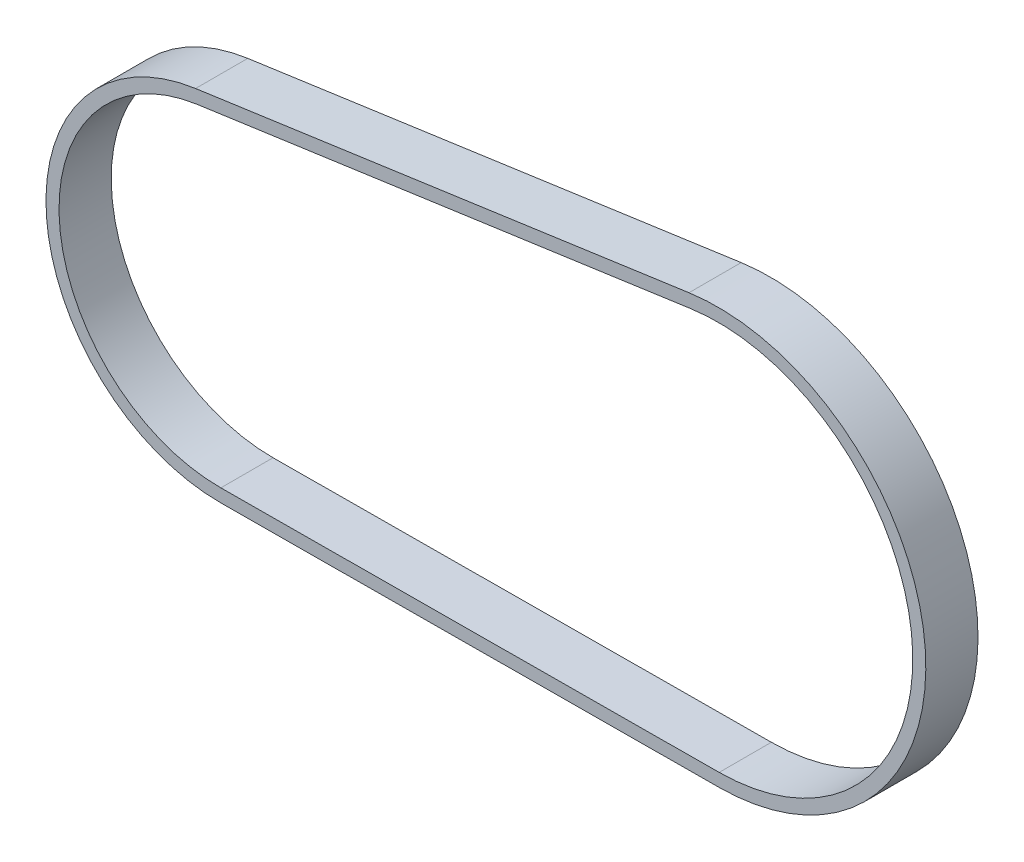
ISO-10303-21;
HEADER;
FILE_DESCRIPTION(('STEP AP214'),'2;1');
FILE_NAME('part.step','',(''),(''),'','','');
FILE_SCHEMA(('AUTOMOTIVE_DESIGN { 1 0 10303 214 1 1 1 1 }'));
ENDSEC;
DATA;
#1=APPLICATION_CONTEXT('core data for automotive mechanical design processes');
#2=APPLICATION_PROTOCOL_DEFINITION('international standard','automotive_design',2000,#1);
#3=PRODUCT_CONTEXT('',#1,'mechanical');
#4=PRODUCT('Part','Part','',(#3));
#5=PRODUCT_RELATED_PRODUCT_CATEGORY('part','',(#4));
#6=PRODUCT_DEFINITION_FORMATION('','',#4);
#7=PRODUCT_DEFINITION_CONTEXT('part definition',#1,'design');
#8=PRODUCT_DEFINITION('design','',#6,#7);
#9=PRODUCT_DEFINITION_SHAPE('','',#8);
#10=(LENGTH_UNIT() NAMED_UNIT(*) SI_UNIT(.MILLI.,.METRE.));
#11=(NAMED_UNIT(*) PLANE_ANGLE_UNIT() SI_UNIT($,.RADIAN.));
#12=(NAMED_UNIT(*) SI_UNIT($,.STERADIAN.) SOLID_ANGLE_UNIT());
#13=UNCERTAINTY_MEASURE_WITH_UNIT(LENGTH_MEASURE(1.E-05),#10,'distance_accuracy_value','');
#14=(GEOMETRIC_REPRESENTATION_CONTEXT(3) GLOBAL_UNCERTAINTY_ASSIGNED_CONTEXT((#13)) GLOBAL_UNIT_ASSIGNED_CONTEXT((#10,
#11,#12)) REPRESENTATION_CONTEXT('',''));
#15=CARTESIAN_POINT('',(0.,0.,0.));
#16=DIRECTION('',(0.,0.,1.));
#17=DIRECTION('',(1.,0.,0.));
#18=AXIS2_PLACEMENT_3D('',#15,#16,#17);
#19=CARTESIAN_POINT('',(57.260066999998,4.19191014874665,-6.));
#20=DIRECTION('',(0.,0.,1.));
#21=DIRECTION('',(1.,0.,0.));
#22=AXIS2_PLACEMENT_3D('',#19,#20,#21);
#23=CYLINDRICAL_SURFACE('',#22,23.876);
#24=CARTESIAN_POINT('',(57.260066999998,4.19191014874665,0.));
#25=DIRECTION('',(0.,0.,1.));
#26=DIRECTION('',(-1.,0.,0.));
#27=AXIS2_PLACEMENT_3D('',#24,#25,#26);
#28=CIRCLE('',#27,23.876);
#29=CARTESIAN_POINT('',(57.3917669520698,-19.6837266201989,0.));
#30=VERTEX_POINT('',#29);
#31=CARTESIAN_POINT('',(53.9132105438982,27.8321708888963,0.));
#32=VERTEX_POINT('',#31);
#33=EDGE_CURVE('E163',#30,#32,#28,.T.);
#34=ORIENTED_EDGE('',*,*,#33,.F.);
#35=DIRECTION('',(0.,0.,1.));
#36=VECTOR('',#35,1.);
#37=CARTESIAN_POINT('',(57.3917669520698,-19.6837266201989,-6.));
#38=LINE('',#37,#36);
#39=CARTESIAN_POINT('',(57.3917669520698,-19.6837266201989,-6.));
#40=VERTEX_POINT('',#39);
#41=EDGE_CURVE('E12',#40,#30,#38,.T.);
#42=ORIENTED_EDGE('',*,*,#41,.F.);
#43=CARTESIAN_POINT('',(57.260066999998,4.19191014874665,-6.));
#44=DIRECTION('',(0.,0.,1.));
#45=DIRECTION('',(-1.,0.,0.));
#46=AXIS2_PLACEMENT_3D('',#43,#44,#45);
#47=CIRCLE('',#46,23.876);
#48=CARTESIAN_POINT('',(53.9132105438982,27.8321708888963,-6.));
#49=VERTEX_POINT('',#48);
#50=EDGE_CURVE('E167',#40,#49,#47,.T.);
#51=ORIENTED_EDGE('',*,*,#50,.T.);
#52=DIRECTION('',(0.,0.,1.));
#53=VECTOR('',#52,1.);
#54=CARTESIAN_POINT('',(53.9132105438982,27.8321708888963,-6.));
#55=LINE('',#54,#53);
#56=EDGE_CURVE('E68',#49,#32,#55,.T.);
#57=ORIENTED_EDGE('',*,*,#56,.T.);
#58=EDGE_LOOP('',(#34,#42,#51,#57));
#59=FACE_BOUND('',#58,.T.);
#60=ADVANCED_FACE('F65',(#59),#23,.T.);
#61=CARTESIAN_POINT('',(57.3917669520698,-19.6837266201989,-6.));
#62=DIRECTION('',(0.00551599732249396,-0.999984786771048,0.));
#63=DIRECTION('',(0.999984786771048,0.00551599732249396,0.));
#64=AXIS2_PLACEMENT_3D('',#61,#62,#63);
#65=PLANE('',#64);
#66=DIRECTION('',(0.999984786771048,0.00551599732249396,0.));
#67=VECTOR('',#66,1.);
#68=CARTESIAN_POINT('',(57.3917669520698,-19.6837266201989,0.));
#69=LINE('',#68,#67);
#70=CARTESIAN_POINT('',(0.110319946449886,-19.999695735421,0.));
#71=VERTEX_POINT('',#70);
#72=EDGE_CURVE('E171',#71,#30,#69,.T.);
#73=ORIENTED_EDGE('',*,*,#72,.F.);
#74=DIRECTION('',(0.,0.,1.));
#75=VECTOR('',#74,1.);
#76=CARTESIAN_POINT('',(0.110319946449886,-19.999695735421,-6.));
#77=LINE('',#76,#75);
#78=CARTESIAN_POINT('',(0.110319946449886,-19.999695735421,-6.));
#79=VERTEX_POINT('',#78);
#80=EDGE_CURVE('E73',#79,#71,#77,.T.);
#81=ORIENTED_EDGE('',*,*,#80,.F.);
#82=DIRECTION('',(0.999984786771048,0.00551599732249396,0.));
#83=VECTOR('',#82,1.);
#84=CARTESIAN_POINT('',(57.3917669520698,-19.6837266201989,-6.));
#85=LINE('',#84,#83);
#86=EDGE_CURVE('E177',#79,#40,#85,.T.);
#87=ORIENTED_EDGE('',*,*,#86,.T.);
#88=ORIENTED_EDGE('',*,*,#41,.T.);
#89=EDGE_LOOP('',(#73,#81,#87,#88));
#90=FACE_BOUND('',#89,.T.);
#91=ADVANCED_FACE('F203',(#90),#65,.T.);
#92=CARTESIAN_POINT('',(0.,0.,-6.));
#93=DIRECTION('',(0.,0.,1.));
#94=DIRECTION('',(1.,0.,0.));
#95=AXIS2_PLACEMENT_3D('',#92,#93,#94);
#96=CYLINDRICAL_SURFACE('',#95,20.);
#97=CARTESIAN_POINT('',(0.,0.,0.));
#98=DIRECTION('',(0.,0.,1.));
#99=DIRECTION('',(-1.,0.,0.));
#100=AXIS2_PLACEMENT_3D('',#97,#98,#99);
#101=CIRCLE('',#100,20.);
#102=CARTESIAN_POINT('',(-2.80353196188625,19.8025303569691,0.));
#103=VERTEX_POINT('',#102);
#104=EDGE_CURVE('E185',#103,#71,#101,.T.);
#105=ORIENTED_EDGE('',*,*,#104,.F.);
#106=DIRECTION('',(0.,0.,1.));
#107=VECTOR('',#106,1.);
#108=CARTESIAN_POINT('',(-2.80353196188625,19.8025303569691,-6.));
#109=LINE('',#108,#107);
#110=CARTESIAN_POINT('',(-2.80353196188625,19.8025303569691,-6.));
#111=VERTEX_POINT('',#110);
#112=EDGE_CURVE('E190',#111,#103,#109,.T.);
#113=ORIENTED_EDGE('',*,*,#112,.F.);
#114=CARTESIAN_POINT('',(0.,0.,-6.));
#115=DIRECTION('',(0.,0.,1.));
#116=DIRECTION('',(-1.,0.,0.));
#117=AXIS2_PLACEMENT_3D('',#114,#115,#116);
#118=CIRCLE('',#117,20.);
#119=EDGE_CURVE('E174',#111,#79,#118,.T.);
#120=ORIENTED_EDGE('',*,*,#119,.T.);
#121=ORIENTED_EDGE('',*,*,#80,.T.);
#122=EDGE_LOOP('',(#105,#113,#120,#121));
#123=FACE_BOUND('',#122,.T.);
#124=ADVANCED_FACE('F207',(#123),#96,.T.);
#125=CARTESIAN_POINT('',(-2.80353196188625,19.8025303569691,-6.));
#126=DIRECTION('',(-0.140176598094312,0.990126517848454,0.));
#127=DIRECTION('',(-0.990126517848455,-0.140176598094312,0.));
#128=AXIS2_PLACEMENT_3D('',#125,#126,#127);
#129=PLANE('',#128);
#130=DIRECTION('',(-0.990126517848454,-0.140176598094312,0.));
#131=VECTOR('',#130,1.);
#132=CARTESIAN_POINT('',(-2.80353196188625,19.8025303569691,0.));
#133=LINE('',#132,#131);
#134=EDGE_CURVE('E182',#32,#103,#133,.T.);
#135=ORIENTED_EDGE('',*,*,#134,.F.);
#136=ORIENTED_EDGE('',*,*,#56,.F.);
#137=DIRECTION('',(-0.990126517848454,-0.140176598094312,0.));
#138=VECTOR('',#137,1.);
#139=CARTESIAN_POINT('',(-2.80353196188625,19.8025303569691,-6.));
#140=LINE('',#139,#138);
#141=EDGE_CURVE('E170',#49,#111,#140,.T.);
#142=ORIENTED_EDGE('',*,*,#141,.T.);
#143=ORIENTED_EDGE('',*,*,#112,.T.);
#144=EDGE_LOOP('',(#135,#136,#142,#143));
#145=FACE_BOUND('',#144,.T.);
#146=ADVANCED_FACE('F198',(#145),#129,.T.);
#147=CARTESIAN_POINT('',(57.260066999998,4.19191014874665,-6.));
#148=DIRECTION('',(0.,0.,1.));
#149=DIRECTION('',(1.,0.,0.));
#150=AXIS2_PLACEMENT_3D('',#147,#148,#149);
#151=PLANE('',#150);
#152=DIRECTION('',(0.999984786771048,0.00551599732249396,0.));
#153=VECTOR('',#152,1.);
#154=CARTESIAN_POINT('',(57.3834929560861,-18.1837494400423,-6.));
#155=LINE('',#154,#153);
#156=CARTESIAN_POINT('',(0.102045950466145,-18.4997185552644,-6.));
#157=VERTEX_POINT('',#156);
#158=CARTESIAN_POINT('',(57.3834929560861,-18.1837494400423,-6.));
#159=VERTEX_POINT('',#158);
#160=EDGE_CURVE('E138',#157,#159,#155,.T.);
#161=ORIENTED_EDGE('',*,*,#160,.T.);
#162=CARTESIAN_POINT('',(57.260066999998,4.19191014874665,-6.));
#163=DIRECTION('',(0.,0.,-1.));
#164=DIRECTION('',(-1.,0.,0.));
#165=AXIS2_PLACEMENT_3D('',#162,#163,#164);
#166=CIRCLE('',#165,22.376);
#167=CARTESIAN_POINT('',(54.1234754410397,26.3469811121237,-6.));
#168=VERTEX_POINT('',#167);
#169=EDGE_CURVE('E132',#159,#168,#166,.F.);
#170=ORIENTED_EDGE('',*,*,#169,.T.);
#171=DIRECTION('',(-0.990126517848455,-0.140176598094312,0.));
#172=VECTOR('',#171,1.);
#173=CARTESIAN_POINT('',(54.1234754410396,26.3469811121237,-6.));
#174=LINE('',#173,#172);
#175=CARTESIAN_POINT('',(-2.59326706474478,18.3173405801964,-6.));
#176=VERTEX_POINT('',#175);
#177=EDGE_CURVE('E141',#168,#176,#174,.T.);
#178=ORIENTED_EDGE('',*,*,#177,.T.);
#179=CARTESIAN_POINT('',(0.,0.,-6.));
#180=DIRECTION('',(0.,0.,-1.));
#181=DIRECTION('',(-1.,0.,0.));
#182=AXIS2_PLACEMENT_3D('',#179,#180,#181);
#183=CIRCLE('',#182,18.5);
#184=EDGE_CURVE('E81',#176,#157,#183,.F.);
#185=ORIENTED_EDGE('',*,*,#184,.T.);
#186=EDGE_LOOP('',(#161,#170,#178,#185));
#187=FACE_BOUND('',#186,.T.);
#188=ORIENTED_EDGE('',*,*,#50,.F.);
#189=ORIENTED_EDGE('',*,*,#86,.F.);
#190=ORIENTED_EDGE('',*,*,#119,.F.);
#191=ORIENTED_EDGE('',*,*,#141,.F.);
#192=EDGE_LOOP('',(#188,#189,#190,#191));
#193=FACE_BOUND('',#192,.T.);
#194=ADVANCED_FACE('F145',(#187,#193),#151,.F.);
#195=CARTESIAN_POINT('',(57.260066999998,4.19191014874665,0.));
#196=DIRECTION('',(0.,0.,1.));
#197=DIRECTION('',(1.,0.,0.));
#198=AXIS2_PLACEMENT_3D('',#195,#196,#197);
#199=PLANE('',#198);
#200=CARTESIAN_POINT('',(57.260066999998,4.19191014874665,0.));
#201=DIRECTION('',(0.,0.,-1.));
#202=DIRECTION('',(-1.,0.,0.));
#203=AXIS2_PLACEMENT_3D('',#200,#201,#202);
#204=CIRCLE('',#203,22.376);
#205=CARTESIAN_POINT('',(57.3834929560861,-18.1837494400423,0.));
#206=VERTEX_POINT('',#205);
#207=CARTESIAN_POINT('',(54.1234754410397,26.3469811121237,0.));
#208=VERTEX_POINT('',#207);
#209=EDGE_CURVE('E89',#206,#208,#204,.F.);
#210=ORIENTED_EDGE('',*,*,#209,.F.);
#211=DIRECTION('',(0.999984786771048,0.00551599732249396,0.));
#212=VECTOR('',#211,1.);
#213=CARTESIAN_POINT('',(57.3834929560861,-18.1837494400423,0.));
#214=LINE('',#213,#212);
#215=CARTESIAN_POINT('',(0.102045950466145,-18.4997185552644,0.));
#216=VERTEX_POINT('',#215);
#217=EDGE_CURVE('E148',#216,#206,#214,.T.);
#218=ORIENTED_EDGE('',*,*,#217,.F.);
#219=CARTESIAN_POINT('',(0.,0.,0.));
#220=DIRECTION('',(0.,0.,-1.));
#221=DIRECTION('',(-1.,0.,0.));
#222=AXIS2_PLACEMENT_3D('',#219,#220,#221);
#223=CIRCLE('',#222,18.5);
#224=CARTESIAN_POINT('',(-2.59326706474478,18.3173405801964,0.));
#225=VERTEX_POINT('',#224);
#226=EDGE_CURVE('E151',#225,#216,#223,.F.);
#227=ORIENTED_EDGE('',*,*,#226,.F.);
#228=DIRECTION('',(-0.990126517848455,-0.140176598094312,0.));
#229=VECTOR('',#228,1.);
#230=CARTESIAN_POINT('',(54.1234754410396,26.3469811121237,0.));
#231=LINE('',#230,#229);
#232=EDGE_CURVE('E157',#208,#225,#231,.T.);
#233=ORIENTED_EDGE('',*,*,#232,.F.);
#234=EDGE_LOOP('',(#210,#218,#227,#233));
#235=FACE_BOUND('',#234,.T.);
#236=ORIENTED_EDGE('',*,*,#33,.T.);
#237=ORIENTED_EDGE('',*,*,#134,.T.);
#238=ORIENTED_EDGE('',*,*,#104,.T.);
#239=ORIENTED_EDGE('',*,*,#72,.T.);
#240=EDGE_LOOP('',(#236,#237,#238,#239));
#241=FACE_BOUND('',#240,.T.);
#242=ADVANCED_FACE('F200',(#235,#241),#199,.T.);
#243=CARTESIAN_POINT('',(57.260066999998,4.19191014874665,-6.));
#244=DIRECTION('',(0.,0.,1.));
#245=DIRECTION('',(1.,0.,0.));
#246=AXIS2_PLACEMENT_3D('',#243,#244,#245);
#247=CYLINDRICAL_SURFACE('',#246,22.376);
#248=ORIENTED_EDGE('',*,*,#209,.T.);
#249=DIRECTION('',(0.,0.,1.));
#250=VECTOR('',#249,1.);
#251=CARTESIAN_POINT('',(54.1234754410397,26.3469811121237,-6.));
#252=LINE('',#251,#250);
#253=EDGE_CURVE('E128',#168,#208,#252,.T.);
#254=ORIENTED_EDGE('',*,*,#253,.F.);
#255=ORIENTED_EDGE('',*,*,#169,.F.);
#256=DIRECTION('',(0.,0.,1.));
#257=VECTOR('',#256,1.);
#258=CARTESIAN_POINT('',(57.3834929560861,-18.1837494400423,-6.));
#259=LINE('',#258,#257);
#260=EDGE_CURVE('E161',#159,#206,#259,.T.);
#261=ORIENTED_EDGE('',*,*,#260,.T.);
#262=EDGE_LOOP('',(#248,#254,#255,#261));
#263=FACE_BOUND('',#262,.T.);
#264=ADVANCED_FACE('F130',(#263),#247,.F.);
#265=CARTESIAN_POINT('',(57.3834929560861,-18.1837494400423,-6.));
#266=DIRECTION('',(0.00551599732249396,-0.999984786771048,0.));
#267=DIRECTION('',(0.999984786771048,0.00551599732249396,0.));
#268=AXIS2_PLACEMENT_3D('',#265,#266,#267);
#269=PLANE('',#268);
#270=ORIENTED_EDGE('',*,*,#217,.T.);
#271=ORIENTED_EDGE('',*,*,#260,.F.);
#272=ORIENTED_EDGE('',*,*,#160,.F.);
#273=DIRECTION('',(0.,0.,1.));
#274=VECTOR('',#273,1.);
#275=CARTESIAN_POINT('',(0.102045950466145,-18.4997185552644,-6.));
#276=LINE('',#275,#274);
#277=EDGE_CURVE('E164',#157,#216,#276,.T.);
#278=ORIENTED_EDGE('',*,*,#277,.T.);
#279=EDGE_LOOP('',(#270,#271,#272,#278));
#280=FACE_BOUND('',#279,.T.);
#281=ADVANCED_FACE('F260',(#280),#269,.F.);
#282=CARTESIAN_POINT('',(0.,0.,-6.));
#283=DIRECTION('',(0.,0.,1.));
#284=DIRECTION('',(1.,0.,0.));
#285=AXIS2_PLACEMENT_3D('',#282,#283,#284);
#286=CYLINDRICAL_SURFACE('',#285,18.5);
#287=ORIENTED_EDGE('',*,*,#226,.T.);
#288=ORIENTED_EDGE('',*,*,#277,.F.);
#289=ORIENTED_EDGE('',*,*,#184,.F.);
#290=DIRECTION('',(0.,0.,1.));
#291=VECTOR('',#290,1.);
#292=CARTESIAN_POINT('',(-2.59326706474478,18.3173405801964,-6.));
#293=LINE('',#292,#291);
#294=EDGE_CURVE('E137',#176,#225,#293,.T.);
#295=ORIENTED_EDGE('',*,*,#294,.T.);
#296=EDGE_LOOP('',(#287,#288,#289,#295));
#297=FACE_BOUND('',#296,.T.);
#298=ADVANCED_FACE('F269',(#297),#286,.F.);
#299=CARTESIAN_POINT('',(54.1234754410396,26.3469811121237,-6.));
#300=DIRECTION('',(-0.140176598094312,0.990126517848454,0.));
#301=DIRECTION('',(-0.990126517848455,-0.140176598094312,0.));
#302=AXIS2_PLACEMENT_3D('',#299,#300,#301);
#303=PLANE('',#302);
#304=ORIENTED_EDGE('',*,*,#232,.T.);
#305=ORIENTED_EDGE('',*,*,#294,.F.);
#306=ORIENTED_EDGE('',*,*,#177,.F.);
#307=ORIENTED_EDGE('',*,*,#253,.T.);
#308=EDGE_LOOP('',(#304,#305,#306,#307));
#309=FACE_BOUND('',#308,.T.);
#310=ADVANCED_FACE('F142',(#309),#303,.F.);
#311=CLOSED_SHELL('',(#60,#91,#124,#146,#194,#242,#264,#281,#298,#310));
#312=MANIFOLD_SOLID_BREP('B2',#311);
#313=ADVANCED_BREP_SHAPE_REPRESENTATION('',(#18,#312),#14);
#314=SHAPE_DEFINITION_REPRESENTATION(#9,#313);
ENDSEC;
END-ISO-10303-21;
